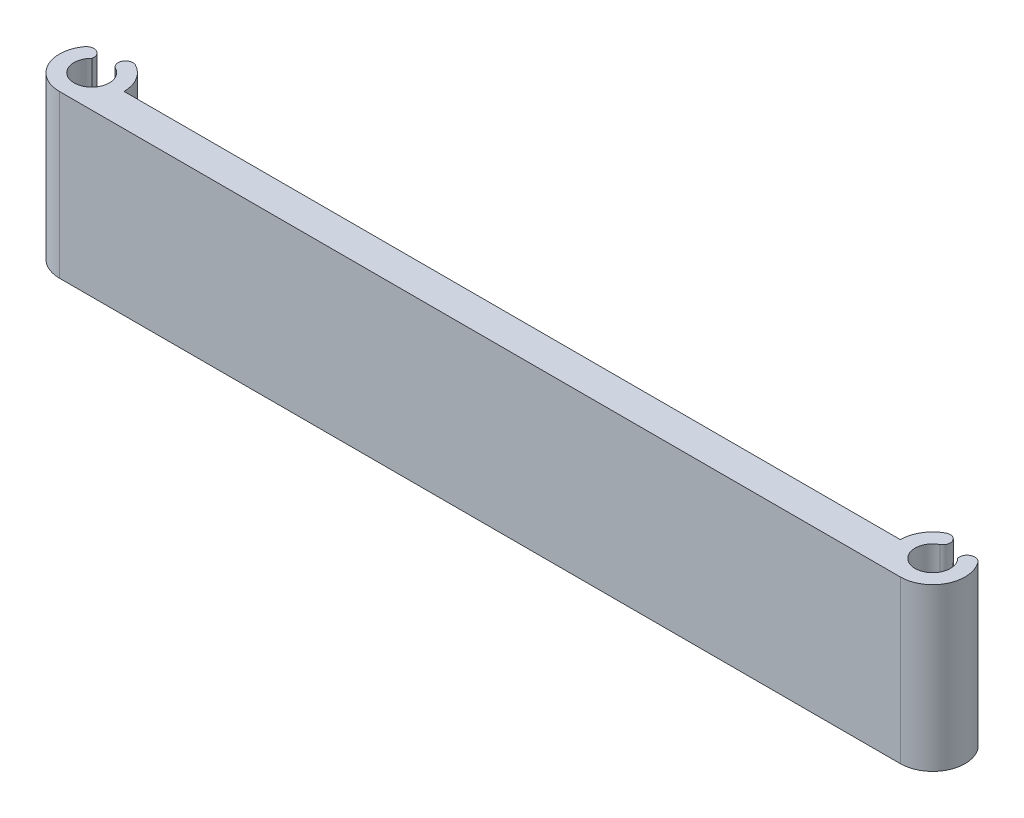
ISO-10303-21;
HEADER;
FILE_DESCRIPTION(('STEP AP214'),'2;1');
FILE_NAME('part.step','',(''),(''),'','','');
FILE_SCHEMA(('AUTOMOTIVE_DESIGN { 1 0 10303 214 1 1 1 1 }'));
ENDSEC;
DATA;
#1=APPLICATION_CONTEXT('core data for automotive mechanical design processes');
#2=APPLICATION_PROTOCOL_DEFINITION('international standard','automotive_design',2000,#1);
#3=PRODUCT_CONTEXT('',#1,'mechanical');
#4=PRODUCT('Part','Part','',(#3));
#5=PRODUCT_RELATED_PRODUCT_CATEGORY('part','',(#4));
#6=PRODUCT_DEFINITION_FORMATION('','',#4);
#7=PRODUCT_DEFINITION_CONTEXT('part definition',#1,'design');
#8=PRODUCT_DEFINITION('design','',#6,#7);
#9=PRODUCT_DEFINITION_SHAPE('','',#8);
#10=(LENGTH_UNIT() NAMED_UNIT(*) SI_UNIT(.MILLI.,.METRE.));
#11=(NAMED_UNIT(*) PLANE_ANGLE_UNIT() SI_UNIT($,.RADIAN.));
#12=(NAMED_UNIT(*) SI_UNIT($,.STERADIAN.) SOLID_ANGLE_UNIT());
#13=UNCERTAINTY_MEASURE_WITH_UNIT(LENGTH_MEASURE(1.E-05),#10,'distance_accuracy_value','');
#14=(GEOMETRIC_REPRESENTATION_CONTEXT(3) GLOBAL_UNCERTAINTY_ASSIGNED_CONTEXT((#13)) GLOBAL_UNIT_ASSIGNED_CONTEXT((#10,
#11,#12)) REPRESENTATION_CONTEXT('',''));
#15=CARTESIAN_POINT('',(0.,0.,0.));
#16=DIRECTION('',(0.,0.,1.));
#17=DIRECTION('',(1.,0.,0.));
#18=AXIS2_PLACEMENT_3D('',#15,#16,#17);
#19=CARTESIAN_POINT('',(-81.6966425521741,30.,-2.67008988531395));
#20=DIRECTION('',(0.,-1.,0.));
#21=DIRECTION('',(0.,0.,-1.));
#22=AXIS2_PLACEMENT_3D('',#19,#20,#21);
#23=CYLINDRICAL_SURFACE('',#22,1.43989625620209);
#24=CARTESIAN_POINT('',(-81.6966425521741,0.,-2.67008988531395));
#25=DIRECTION('',(0.,1.,0.));
#26=DIRECTION('',(0.,0.,1.));
#27=AXIS2_PLACEMENT_3D('',#24,#25,#26);
#28=CIRCLE('',#27,1.43989625620209);
#29=CARTESIAN_POINT('',(-80.2962462943004,0.,-2.33513981506707));
#30=VERTEX_POINT('',#29);
#31=CARTESIAN_POINT('',(-82.8638927005138,0.,-3.51319623674632));
#32=VERTEX_POINT('',#31);
#33=EDGE_CURVE('E164',#30,#32,#28,.T.);
#34=ORIENTED_EDGE('',*,*,#33,.T.);
#35=DIRECTION('',(0.,-1.,0.));
#36=VECTOR('',#35,1.);
#37=CARTESIAN_POINT('',(-82.8638927005138,30.,-3.51319623674632));
#38=LINE('',#37,#36);
#39=CARTESIAN_POINT('',(-82.8638927005138,30.,-3.51319623674632));
#40=VERTEX_POINT('',#39);
#41=EDGE_CURVE('E11',#40,#32,#38,.T.);
#42=ORIENTED_EDGE('',*,*,#41,.F.);
#43=CARTESIAN_POINT('',(-81.6966425521741,30.,-2.67008988531395));
#44=DIRECTION('',(0.,1.,0.));
#45=DIRECTION('',(0.,0.,1.));
#46=AXIS2_PLACEMENT_3D('',#43,#44,#45);
#47=CIRCLE('',#46,1.43989625620209);
#48=CARTESIAN_POINT('',(-80.2962462943004,30.,-2.33513981506707));
#49=VERTEX_POINT('',#48);
#50=EDGE_CURVE('E198',#49,#40,#47,.T.);
#51=ORIENTED_EDGE('',*,*,#50,.F.);
#52=DIRECTION('',(0.,-1.,0.));
#53=VECTOR('',#52,1.);
#54=CARTESIAN_POINT('',(-80.2962462943004,30.,-2.33513981506707));
#55=LINE('',#54,#53);
#56=EDGE_CURVE('E160',#49,#30,#55,.T.);
#57=ORIENTED_EDGE('',*,*,#56,.T.);
#58=EDGE_LOOP('',(#34,#42,#51,#57));
#59=FACE_BOUND('',#58,.T.);
#60=ADVANCED_FACE('F39',(#59),#23,.T.);
#61=CARTESIAN_POINT('',(-78.,30.,0.));
#62=DIRECTION('',(0.,-1.,0.));
#63=DIRECTION('',(0.,0.,-1.));
#64=AXIS2_PLACEMENT_3D('',#61,#62,#63);
#65=CYLINDRICAL_SURFACE('',#64,6.);
#66=CARTESIAN_POINT('',(-78.,0.,0.));
#67=DIRECTION('',(0.,1.,0.));
#68=DIRECTION('',(0.,0.,1.));
#69=AXIS2_PLACEMENT_3D('',#66,#67,#68);
#70=CIRCLE('',#69,6.);
#71=CARTESIAN_POINT('',(-78.,0.,6.));
#72=VERTEX_POINT('',#71);
#73=EDGE_CURVE('E168',#32,#72,#70,.T.);
#74=ORIENTED_EDGE('',*,*,#73,.T.);
#75=DIRECTION('',(0.,-1.,0.));
#76=VECTOR('',#75,1.);
#77=CARTESIAN_POINT('',(-78.,30.,6.));
#78=LINE('',#77,#76);
#79=CARTESIAN_POINT('',(-78.,30.,6.));
#80=VERTEX_POINT('',#79);
#81=EDGE_CURVE('E48',#80,#72,#78,.T.);
#82=ORIENTED_EDGE('',*,*,#81,.F.);
#83=CARTESIAN_POINT('',(-78.,30.,0.));
#84=DIRECTION('',(0.,1.,0.));
#85=DIRECTION('',(0.,0.,1.));
#86=AXIS2_PLACEMENT_3D('',#83,#84,#85);
#87=CIRCLE('',#86,6.);
#88=EDGE_CURVE('E111',#40,#80,#87,.T.);
#89=ORIENTED_EDGE('',*,*,#88,.F.);
#90=ORIENTED_EDGE('',*,*,#41,.T.);
#91=EDGE_LOOP('',(#74,#82,#89,#90));
#92=FACE_BOUND('',#91,.T.);
#93=ADVANCED_FACE('F292',(#92),#65,.T.);
#94=CARTESIAN_POINT('',(78.,30.,6.));
#95=DIRECTION('',(0.,0.,-1.));
#96=DIRECTION('',(-1.,0.,0.));
#97=AXIS2_PLACEMENT_3D('',#94,#95,#96);
#98=PLANE('',#97);
#99=DIRECTION('',(1.,0.,0.));
#100=VECTOR('',#99,1.);
#101=CARTESIAN_POINT('',(78.,0.,6.));
#102=LINE('',#101,#100);
#103=CARTESIAN_POINT('',(78.,0.,6.));
#104=VERTEX_POINT('',#103);
#105=EDGE_CURVE('E171',#72,#104,#102,.T.);
#106=ORIENTED_EDGE('',*,*,#105,.T.);
#107=DIRECTION('',(0.,-1.,0.));
#108=VECTOR('',#107,1.);
#109=CARTESIAN_POINT('',(78.,30.,6.));
#110=LINE('',#109,#108);
#111=CARTESIAN_POINT('',(78.,30.,6.));
#112=VERTEX_POINT('',#111);
#113=EDGE_CURVE('E225',#112,#104,#110,.T.);
#114=ORIENTED_EDGE('',*,*,#113,.F.);
#115=DIRECTION('',(1.,0.,0.));
#116=VECTOR('',#115,1.);
#117=CARTESIAN_POINT('',(78.,30.,6.));
#118=LINE('',#117,#116);
#119=EDGE_CURVE('E235',#80,#112,#118,.T.);
#120=ORIENTED_EDGE('',*,*,#119,.F.);
#121=ORIENTED_EDGE('',*,*,#81,.T.);
#122=EDGE_LOOP('',(#106,#114,#120,#121));
#123=FACE_BOUND('',#122,.T.);
#124=ADVANCED_FACE('F233',(#123),#98,.F.);
#125=CARTESIAN_POINT('',(78.,30.,0.));
#126=DIRECTION('',(0.,-1.,0.));
#127=DIRECTION('',(0.,0.,-1.));
#128=AXIS2_PLACEMENT_3D('',#125,#126,#127);
#129=CYLINDRICAL_SURFACE('',#128,6.);
#130=CARTESIAN_POINT('',(78.,0.,0.));
#131=DIRECTION('',(0.,1.,0.));
#132=DIRECTION('',(0.,0.,-1.));
#133=AXIS2_PLACEMENT_3D('',#130,#131,#132);
#134=CIRCLE('',#133,6.);
#135=CARTESIAN_POINT('',(82.8638927005138,0.,-3.51319623674633));
#136=VERTEX_POINT('',#135);
#137=EDGE_CURVE('E174',#104,#136,#134,.T.);
#138=ORIENTED_EDGE('',*,*,#137,.T.);
#139=DIRECTION('',(0.,-1.,0.));
#140=VECTOR('',#139,1.);
#141=CARTESIAN_POINT('',(82.8638927005138,30.,-3.51319623674633));
#142=LINE('',#141,#140);
#143=CARTESIAN_POINT('',(82.8638927005138,30.,-3.51319623674633));
#144=VERTEX_POINT('',#143);
#145=EDGE_CURVE('E221',#144,#136,#142,.T.);
#146=ORIENTED_EDGE('',*,*,#145,.F.);
#147=CARTESIAN_POINT('',(78.,30.,0.));
#148=DIRECTION('',(0.,1.,0.));
#149=DIRECTION('',(0.,0.,-1.));
#150=AXIS2_PLACEMENT_3D('',#147,#148,#149);
#151=CIRCLE('',#150,6.);
#152=EDGE_CURVE('E254',#112,#144,#151,.T.);
#153=ORIENTED_EDGE('',*,*,#152,.F.);
#154=ORIENTED_EDGE('',*,*,#113,.T.);
#155=EDGE_LOOP('',(#138,#146,#153,#154));
#156=FACE_BOUND('',#155,.T.);
#157=ADVANCED_FACE('F244',(#156),#129,.T.);
#158=CARTESIAN_POINT('',(81.6966425521741,30.,-2.67008988531395));
#159=DIRECTION('',(0.,-1.,0.));
#160=DIRECTION('',(0.,0.,-1.));
#161=AXIS2_PLACEMENT_3D('',#158,#159,#160);
#162=CYLINDRICAL_SURFACE('',#161,1.43989625620209);
#163=CARTESIAN_POINT('',(81.6966425521741,0.,-2.67008988531395));
#164=DIRECTION('',(0.,1.,0.));
#165=DIRECTION('',(0.,0.,-1.));
#166=AXIS2_PLACEMENT_3D('',#163,#164,#165);
#167=CIRCLE('',#166,1.43989625620209);
#168=CARTESIAN_POINT('',(80.2962462943004,0.,-2.33513981506707));
#169=VERTEX_POINT('',#168);
#170=EDGE_CURVE('E177',#136,#169,#167,.T.);
#171=ORIENTED_EDGE('',*,*,#170,.T.);
#172=DIRECTION('',(0.,-1.,0.));
#173=VECTOR('',#172,1.);
#174=CARTESIAN_POINT('',(80.2962462943004,30.,-2.33513981506707));
#175=LINE('',#174,#173);
#176=CARTESIAN_POINT('',(80.2962462943004,30.,-2.33513981506707));
#177=VERTEX_POINT('',#176);
#178=EDGE_CURVE('E217',#177,#169,#175,.T.);
#179=ORIENTED_EDGE('',*,*,#178,.F.);
#180=CARTESIAN_POINT('',(81.6966425521741,30.,-2.67008988531395));
#181=DIRECTION('',(0.,1.,0.));
#182=DIRECTION('',(0.,0.,-1.));
#183=AXIS2_PLACEMENT_3D('',#180,#181,#182);
#184=CIRCLE('',#183,1.43989625620209);
#185=EDGE_CURVE('E250',#144,#177,#184,.T.);
#186=ORIENTED_EDGE('',*,*,#185,.F.);
#187=ORIENTED_EDGE('',*,*,#145,.T.);
#188=EDGE_LOOP('',(#171,#179,#186,#187));
#189=FACE_BOUND('',#188,.T.);
#190=ADVANCED_FACE('F248',(#189),#162,.T.);
#191=CARTESIAN_POINT('',(78.,30.,0.));
#192=DIRECTION('',(0.,-1.,0.));
#193=DIRECTION('',(0.,0.,-1.));
#194=AXIS2_PLACEMENT_3D('',#191,#192,#193);
#195=CYLINDRICAL_SURFACE('',#194,3.275);
#196=CARTESIAN_POINT('',(78.,0.,0.));
#197=DIRECTION('',(0.,-1.,0.));
#198=DIRECTION('',(0.,0.,-1.));
#199=AXIS2_PLACEMENT_3D('',#196,#197,#198);
#200=CIRCLE('',#199,3.275);
#201=CARTESIAN_POINT('',(76.4495535986174,0.,-2.8847427886104));
#202=VERTEX_POINT('',#201);
#203=EDGE_CURVE('E180',#169,#202,#200,.T.);
#204=ORIENTED_EDGE('',*,*,#203,.T.);
#205=DIRECTION('',(0.,-1.,0.));
#206=VECTOR('',#205,1.);
#207=CARTESIAN_POINT('',(76.4495535986174,30.,-2.8847427886104));
#208=LINE('',#207,#206);
#209=CARTESIAN_POINT('',(76.4495535986174,30.,-2.8847427886104));
#210=VERTEX_POINT('',#209);
#211=EDGE_CURVE('E213',#210,#202,#208,.T.);
#212=ORIENTED_EDGE('',*,*,#211,.F.);
#213=CARTESIAN_POINT('',(78.,30.,0.));
#214=DIRECTION('',(0.,-1.,0.));
#215=DIRECTION('',(0.,0.,-1.));
#216=AXIS2_PLACEMENT_3D('',#213,#214,#215);
#217=CIRCLE('',#216,3.275);
#218=EDGE_CURVE('E253',#177,#210,#217,.T.);
#219=ORIENTED_EDGE('',*,*,#218,.F.);
#220=ORIENTED_EDGE('',*,*,#178,.T.);
#221=EDGE_LOOP('',(#204,#212,#219,#220));
#222=FACE_BOUND('',#221,.T.);
#223=ADVANCED_FACE('F305',(#222),#195,.F.);
#224=CARTESIAN_POINT('',(75.8045205537674,30.,-4.0848838724216));
#225=DIRECTION('',(0.,-1.,0.));
#226=DIRECTION('',(0.,0.,-1.));
#227=AXIS2_PLACEMENT_3D('',#224,#225,#226);
#228=CYLINDRICAL_SURFACE('',#227,1.3625);
#229=CARTESIAN_POINT('',(75.8045205537674,0.,-4.0848838724216));
#230=DIRECTION('',(0.,1.,0.));
#231=DIRECTION('',(0.,0.,1.));
#232=AXIS2_PLACEMENT_3D('',#229,#230,#231);
#233=CIRCLE('',#232,1.3625);
#234=CARTESIAN_POINT('',(75.1594875089174,0.,-5.2850249562328));
#235=VERTEX_POINT('',#234);
#236=EDGE_CURVE('E183',#202,#235,#233,.T.);
#237=ORIENTED_EDGE('',*,*,#236,.T.);
#238=DIRECTION('',(0.,-1.,0.));
#239=VECTOR('',#238,1.);
#240=CARTESIAN_POINT('',(75.1594875089174,30.,-5.2850249562328));
#241=LINE('',#240,#239);
#242=CARTESIAN_POINT('',(75.1594875089174,30.,-5.2850249562328));
#243=VERTEX_POINT('',#242);
#244=EDGE_CURVE('E209',#243,#235,#241,.T.);
#245=ORIENTED_EDGE('',*,*,#244,.F.);
#246=CARTESIAN_POINT('',(75.8045205537674,30.,-4.0848838724216));
#247=DIRECTION('',(0.,1.,0.));
#248=DIRECTION('',(0.,0.,1.));
#249=AXIS2_PLACEMENT_3D('',#246,#247,#248);
#250=CIRCLE('',#249,1.3625);
#251=EDGE_CURVE('E258',#210,#243,#250,.T.);
#252=ORIENTED_EDGE('',*,*,#251,.F.);
#253=ORIENTED_EDGE('',*,*,#211,.T.);
#254=EDGE_LOOP('',(#237,#245,#252,#253));
#255=FACE_BOUND('',#254,.T.);
#256=ADVANCED_FACE('F308',(#255),#228,.T.);
#257=CARTESIAN_POINT('',(78.,30.,0.));
#258=DIRECTION('',(0.,-1.,0.));
#259=DIRECTION('',(0.,0.,-1.));
#260=AXIS2_PLACEMENT_3D('',#257,#258,#259);
#261=CYLINDRICAL_SURFACE('',#260,6.);
#262=CARTESIAN_POINT('',(78.,0.,0.));
#263=DIRECTION('',(0.,1.,0.));
#264=DIRECTION('',(0.,0.,-1.));
#265=AXIS2_PLACEMENT_3D('',#262,#263,#264);
#266=CIRCLE('',#265,6.);
#267=CARTESIAN_POINT('',(72.,0.,0.));
#268=VERTEX_POINT('',#267);
#269=EDGE_CURVE('E186',#235,#268,#266,.T.);
#270=ORIENTED_EDGE('',*,*,#269,.T.);
#271=DIRECTION('',(0.,-1.,0.));
#272=VECTOR('',#271,1.);
#273=CARTESIAN_POINT('',(72.,30.,0.));
#274=LINE('',#273,#272);
#275=CARTESIAN_POINT('',(72.,30.,0.));
#276=VERTEX_POINT('',#275);
#277=EDGE_CURVE('E205',#276,#268,#274,.T.);
#278=ORIENTED_EDGE('',*,*,#277,.F.);
#279=CARTESIAN_POINT('',(78.,30.,0.));
#280=DIRECTION('',(0.,1.,0.));
#281=DIRECTION('',(0.,0.,-1.));
#282=AXIS2_PLACEMENT_3D('',#279,#280,#281);
#283=CIRCLE('',#282,6.);
#284=EDGE_CURVE('E265',#243,#276,#283,.T.);
#285=ORIENTED_EDGE('',*,*,#284,.F.);
#286=ORIENTED_EDGE('',*,*,#244,.T.);
#287=EDGE_LOOP('',(#270,#278,#285,#286));
#288=FACE_BOUND('',#287,.T.);
#289=ADVANCED_FACE('F273',(#288),#261,.T.);
#290=CARTESIAN_POINT('',(-72.,30.,0.));
#291=DIRECTION('',(0.,0.,1.));
#292=DIRECTION('',(1.,0.,0.));
#293=AXIS2_PLACEMENT_3D('',#290,#291,#292);
#294=PLANE('',#293);
#295=DIRECTION('',(-1.,0.,0.));
#296=VECTOR('',#295,1.);
#297=CARTESIAN_POINT('',(-72.,0.,0.));
#298=LINE('',#297,#296);
#299=CARTESIAN_POINT('',(-72.,0.,0.));
#300=VERTEX_POINT('',#299);
#301=EDGE_CURVE('E189',#268,#300,#298,.T.);
#302=ORIENTED_EDGE('',*,*,#301,.T.);
#303=DIRECTION('',(0.,-1.,0.));
#304=VECTOR('',#303,1.);
#305=CARTESIAN_POINT('',(-72.,30.,0.));
#306=LINE('',#305,#304);
#307=CARTESIAN_POINT('',(-72.,30.,0.));
#308=VERTEX_POINT('',#307);
#309=EDGE_CURVE('E153',#308,#300,#306,.T.);
#310=ORIENTED_EDGE('',*,*,#309,.F.);
#311=DIRECTION('',(-1.,0.,0.));
#312=VECTOR('',#311,1.);
#313=CARTESIAN_POINT('',(-72.,30.,0.));
#314=LINE('',#313,#312);
#315=EDGE_CURVE('E142',#276,#308,#314,.T.);
#316=ORIENTED_EDGE('',*,*,#315,.F.);
#317=ORIENTED_EDGE('',*,*,#277,.T.);
#318=EDGE_LOOP('',(#302,#310,#316,#317));
#319=FACE_BOUND('',#318,.T.);
#320=ADVANCED_FACE('F277',(#319),#294,.F.);
#321=CARTESIAN_POINT('',(-78.,30.,0.));
#322=DIRECTION('',(0.,-1.,0.));
#323=DIRECTION('',(0.,0.,-1.));
#324=AXIS2_PLACEMENT_3D('',#321,#322,#323);
#325=CYLINDRICAL_SURFACE('',#324,6.);
#326=CARTESIAN_POINT('',(-78.,0.,0.));
#327=DIRECTION('',(0.,1.,0.));
#328=DIRECTION('',(0.,0.,1.));
#329=AXIS2_PLACEMENT_3D('',#326,#327,#328);
#330=CIRCLE('',#329,6.);
#331=CARTESIAN_POINT('',(-75.1594875089174,0.,-5.2850249562328));
#332=VERTEX_POINT('',#331);
#333=EDGE_CURVE('E151',#300,#332,#330,.T.);
#334=ORIENTED_EDGE('',*,*,#333,.T.);
#335=DIRECTION('',(0.,-1.,0.));
#336=VECTOR('',#335,1.);
#337=CARTESIAN_POINT('',(-75.1594875089174,30.,-5.2850249562328));
#338=LINE('',#337,#336);
#339=CARTESIAN_POINT('',(-75.1594875089174,30.,-5.2850249562328));
#340=VERTEX_POINT('',#339);
#341=EDGE_CURVE('E148',#340,#332,#338,.T.);
#342=ORIENTED_EDGE('',*,*,#341,.F.);
#343=CARTESIAN_POINT('',(-78.,30.,0.));
#344=DIRECTION('',(0.,1.,0.));
#345=DIRECTION('',(0.,0.,1.));
#346=AXIS2_PLACEMENT_3D('',#343,#344,#345);
#347=CIRCLE('',#346,6.);
#348=EDGE_CURVE('E136',#308,#340,#347,.T.);
#349=ORIENTED_EDGE('',*,*,#348,.F.);
#350=ORIENTED_EDGE('',*,*,#309,.T.);
#351=EDGE_LOOP('',(#334,#342,#349,#350));
#352=FACE_BOUND('',#351,.T.);
#353=ADVANCED_FACE('F149',(#352),#325,.T.);
#354=CARTESIAN_POINT('',(-75.8045205537674,30.,-4.0848838724216));
#355=DIRECTION('',(0.,-1.,0.));
#356=DIRECTION('',(0.,0.,-1.));
#357=AXIS2_PLACEMENT_3D('',#354,#355,#356);
#358=CYLINDRICAL_SURFACE('',#357,1.3625);
#359=CARTESIAN_POINT('',(-75.8045205537674,0.,-4.0848838724216));
#360=DIRECTION('',(0.,1.,0.));
#361=DIRECTION('',(0.,0.,-1.));
#362=AXIS2_PLACEMENT_3D('',#359,#360,#361);
#363=CIRCLE('',#362,1.3625);
#364=CARTESIAN_POINT('',(-76.4495535986174,0.,-2.88474278861041));
#365=VERTEX_POINT('',#364);
#366=EDGE_CURVE('E97',#332,#365,#363,.T.);
#367=ORIENTED_EDGE('',*,*,#366,.T.);
#368=DIRECTION('',(0.,-1.,0.));
#369=VECTOR('',#368,1.);
#370=CARTESIAN_POINT('',(-76.4495535986174,30.,-2.88474278861041));
#371=LINE('',#370,#369);
#372=CARTESIAN_POINT('',(-76.4495535986174,30.,-2.88474278861041));
#373=VERTEX_POINT('',#372);
#374=EDGE_CURVE('E154',#373,#365,#371,.T.);
#375=ORIENTED_EDGE('',*,*,#374,.F.);
#376=CARTESIAN_POINT('',(-75.8045205537674,30.,-4.0848838724216));
#377=DIRECTION('',(0.,1.,0.));
#378=DIRECTION('',(0.,0.,-1.));
#379=AXIS2_PLACEMENT_3D('',#376,#377,#378);
#380=CIRCLE('',#379,1.3625);
#381=EDGE_CURVE('E140',#340,#373,#380,.T.);
#382=ORIENTED_EDGE('',*,*,#381,.F.);
#383=ORIENTED_EDGE('',*,*,#341,.T.);
#384=EDGE_LOOP('',(#367,#375,#382,#383));
#385=FACE_BOUND('',#384,.T.);
#386=ADVANCED_FACE('F156',(#385),#358,.T.);
#387=CARTESIAN_POINT('',(-78.,30.,0.));
#388=DIRECTION('',(0.,-1.,0.));
#389=DIRECTION('',(0.,0.,-1.));
#390=AXIS2_PLACEMENT_3D('',#387,#388,#389);
#391=CYLINDRICAL_SURFACE('',#390,3.275);
#392=CARTESIAN_POINT('',(-78.,0.,0.));
#393=DIRECTION('',(0.,-1.,0.));
#394=DIRECTION('',(0.,0.,1.));
#395=AXIS2_PLACEMENT_3D('',#392,#393,#394);
#396=CIRCLE('',#395,3.275);
#397=EDGE_CURVE('E103',#365,#30,#396,.T.);
#398=ORIENTED_EDGE('',*,*,#397,.T.);
#399=ORIENTED_EDGE('',*,*,#56,.F.);
#400=CARTESIAN_POINT('',(-78.,30.,0.));
#401=DIRECTION('',(0.,-1.,0.));
#402=DIRECTION('',(0.,0.,1.));
#403=AXIS2_PLACEMENT_3D('',#400,#401,#402);
#404=CIRCLE('',#403,3.275);
#405=EDGE_CURVE('E56',#373,#49,#404,.T.);
#406=ORIENTED_EDGE('',*,*,#405,.F.);
#407=ORIENTED_EDGE('',*,*,#374,.T.);
#408=EDGE_LOOP('',(#398,#399,#406,#407));
#409=FACE_BOUND('',#408,.T.);
#410=ADVANCED_FACE('F281',(#409),#391,.F.);
#411=CARTESIAN_POINT('',(-81.6966425521741,30.,-2.67008988531395));
#412=DIRECTION('',(0.,1.,0.));
#413=DIRECTION('',(0.,0.,1.));
#414=AXIS2_PLACEMENT_3D('',#411,#412,#413);
#415=PLANE('',#414);
#416=ORIENTED_EDGE('',*,*,#50,.T.);
#417=ORIENTED_EDGE('',*,*,#88,.T.);
#418=ORIENTED_EDGE('',*,*,#119,.T.);
#419=ORIENTED_EDGE('',*,*,#152,.T.);
#420=ORIENTED_EDGE('',*,*,#185,.T.);
#421=ORIENTED_EDGE('',*,*,#218,.T.);
#422=ORIENTED_EDGE('',*,*,#251,.T.);
#423=ORIENTED_EDGE('',*,*,#284,.T.);
#424=ORIENTED_EDGE('',*,*,#315,.T.);
#425=ORIENTED_EDGE('',*,*,#348,.T.);
#426=ORIENTED_EDGE('',*,*,#381,.T.);
#427=ORIENTED_EDGE('',*,*,#405,.T.);
#428=EDGE_LOOP('',(#416,#417,#418,#419,#420,#421,#422,#423,#424,#425,#426,#427));
#429=FACE_BOUND('',#428,.T.);
#430=ADVANCED_FACE('F138',(#429),#415,.T.);
#431=CARTESIAN_POINT('',(-81.6966425521741,0.,-2.67008988531395));
#432=DIRECTION('',(0.,1.,0.));
#433=DIRECTION('',(0.,0.,1.));
#434=AXIS2_PLACEMENT_3D('',#431,#432,#433);
#435=PLANE('',#434);
#436=ORIENTED_EDGE('',*,*,#33,.F.);
#437=ORIENTED_EDGE('',*,*,#397,.F.);
#438=ORIENTED_EDGE('',*,*,#366,.F.);
#439=ORIENTED_EDGE('',*,*,#333,.F.);
#440=ORIENTED_EDGE('',*,*,#301,.F.);
#441=ORIENTED_EDGE('',*,*,#269,.F.);
#442=ORIENTED_EDGE('',*,*,#236,.F.);
#443=ORIENTED_EDGE('',*,*,#203,.F.);
#444=ORIENTED_EDGE('',*,*,#170,.F.);
#445=ORIENTED_EDGE('',*,*,#137,.F.);
#446=ORIENTED_EDGE('',*,*,#105,.F.);
#447=ORIENTED_EDGE('',*,*,#73,.F.);
#448=EDGE_LOOP('',(#436,#437,#438,#439,#440,#441,#442,#443,#444,#445,#446,#447));
#449=FACE_BOUND('',#448,.T.);
#450=ADVANCED_FACE('F239',(#449),#435,.F.);
#451=CLOSED_SHELL('',(#60,#93,#124,#157,#190,#223,#256,#289,#320,#353,#386,#410,#430,#450));
#452=MANIFOLD_SOLID_BREP('B2',#451);
#453=ADVANCED_BREP_SHAPE_REPRESENTATION('',(#18,#452),#14);
#454=SHAPE_DEFINITION_REPRESENTATION(#9,#453);
ENDSEC;
END-ISO-10303-21;
